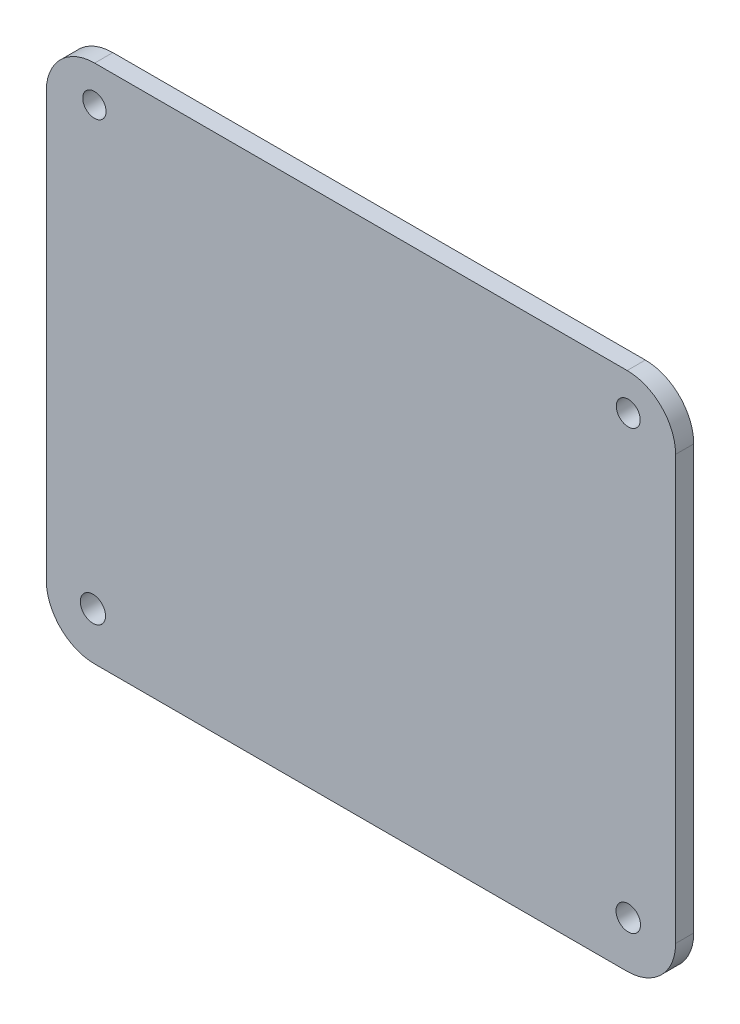
ISO-10303-21;
HEADER;
FILE_DESCRIPTION(('STEP AP214'),'2;1');
FILE_NAME('part.step','',(''),(''),'','','');
FILE_SCHEMA(('AUTOMOTIVE_DESIGN { 1 0 10303 214 1 1 1 1 }'));
ENDSEC;
DATA;
#1=APPLICATION_CONTEXT('core data for automotive mechanical design processes');
#2=APPLICATION_PROTOCOL_DEFINITION('international standard','automotive_design',2000,#1);
#3=PRODUCT_CONTEXT('',#1,'mechanical');
#4=PRODUCT('Part','Part','',(#3));
#5=PRODUCT_RELATED_PRODUCT_CATEGORY('part','',(#4));
#6=PRODUCT_DEFINITION_FORMATION('','',#4);
#7=PRODUCT_DEFINITION_CONTEXT('part definition',#1,'design');
#8=PRODUCT_DEFINITION('design','',#6,#7);
#9=PRODUCT_DEFINITION_SHAPE('','',#8);
#10=(LENGTH_UNIT() NAMED_UNIT(*) SI_UNIT(.MILLI.,.METRE.));
#11=(NAMED_UNIT(*) PLANE_ANGLE_UNIT() SI_UNIT($,.RADIAN.));
#12=(NAMED_UNIT(*) SI_UNIT($,.STERADIAN.) SOLID_ANGLE_UNIT());
#13=UNCERTAINTY_MEASURE_WITH_UNIT(LENGTH_MEASURE(1.E-05),#10,'distance_accuracy_value','');
#14=(GEOMETRIC_REPRESENTATION_CONTEXT(3) GLOBAL_UNCERTAINTY_ASSIGNED_CONTEXT((#13)) GLOBAL_UNIT_ASSIGNED_CONTEXT((#10,
#11,#12)) REPRESENTATION_CONTEXT('',''));
#15=CARTESIAN_POINT('',(0.,0.,0.));
#16=DIRECTION('',(0.,0.,1.));
#17=DIRECTION('',(1.,0.,0.));
#18=AXIS2_PLACEMENT_3D('',#15,#16,#17);
#19=CARTESIAN_POINT('',(-55.88,44.45,3.81));
#20=DIRECTION('',(0.,0.,-1.));
#21=DIRECTION('',(-1.,0.,0.));
#22=AXIS2_PLACEMENT_3D('',#19,#20,#21);
#23=CYLINDRICAL_SURFACE('',#22,10.16);
#24=CARTESIAN_POINT('',(-55.88,44.45,0.));
#25=DIRECTION('',(0.,0.,1.));
#26=DIRECTION('',(1.,0.,0.));
#27=AXIS2_PLACEMENT_3D('',#24,#25,#26);
#28=CIRCLE('',#27,10.16);
#29=CARTESIAN_POINT('',(-55.8799999999999,54.61,0.));
#30=VERTEX_POINT('',#29);
#31=CARTESIAN_POINT('',(-66.04,44.4499999999999,0.));
#32=VERTEX_POINT('',#31);
#33=EDGE_CURVE('E139',#30,#32,#28,.T.);
#34=ORIENTED_EDGE('',*,*,#33,.T.);
#35=DIRECTION('',(0.,0.,-1.));
#36=VECTOR('',#35,1.);
#37=CARTESIAN_POINT('',(-66.04,44.4499999999999,3.81));
#38=LINE('',#37,#36);
#39=CARTESIAN_POINT('',(-66.04,44.4499999999999,3.81));
#40=VERTEX_POINT('',#39);
#41=EDGE_CURVE('E11',#40,#32,#38,.T.);
#42=ORIENTED_EDGE('',*,*,#41,.F.);
#43=CARTESIAN_POINT('',(-55.88,44.45,3.81));
#44=DIRECTION('',(0.,0.,1.));
#45=DIRECTION('',(1.,0.,0.));
#46=AXIS2_PLACEMENT_3D('',#43,#44,#45);
#47=CIRCLE('',#46,10.16);
#48=CARTESIAN_POINT('',(-55.8799999999999,54.61,3.81));
#49=VERTEX_POINT('',#48);
#50=EDGE_CURVE('E162',#49,#40,#47,.T.);
#51=ORIENTED_EDGE('',*,*,#50,.F.);
#52=DIRECTION('',(0.,0.,-1.));
#53=VECTOR('',#52,1.);
#54=CARTESIAN_POINT('',(-55.8799999999999,54.61,3.81));
#55=LINE('',#54,#53);
#56=EDGE_CURVE('E135',#49,#30,#55,.T.);
#57=ORIENTED_EDGE('',*,*,#56,.T.);
#58=EDGE_LOOP('',(#34,#42,#51,#57));
#59=FACE_BOUND('',#58,.T.);
#60=ADVANCED_FACE('F38',(#59),#23,.T.);
#61=CARTESIAN_POINT('',(-66.04,-44.4499999999999,3.81));
#62=DIRECTION('',(1.,0.,0.));
#63=DIRECTION('',(0.,1.,0.));
#64=AXIS2_PLACEMENT_3D('',#61,#62,#63);
#65=PLANE('',#64);
#66=DIRECTION('',(0.,-1.,0.));
#67=VECTOR('',#66,1.);
#68=CARTESIAN_POINT('',(-66.04,-44.4499999999999,0.));
#69=LINE('',#68,#67);
#70=CARTESIAN_POINT('',(-66.04,-44.45,0.));
#71=VERTEX_POINT('',#70);
#72=EDGE_CURVE('E143',#32,#71,#69,.T.);
#73=ORIENTED_EDGE('',*,*,#72,.T.);
#74=DIRECTION('',(0.,0.,-1.));
#75=VECTOR('',#74,1.);
#76=CARTESIAN_POINT('',(-66.04,-44.45,3.81));
#77=LINE('',#76,#75);
#78=CARTESIAN_POINT('',(-66.04,-44.45,3.81));
#79=VERTEX_POINT('',#78);
#80=EDGE_CURVE('E47',#79,#71,#77,.T.);
#81=ORIENTED_EDGE('',*,*,#80,.F.);
#82=DIRECTION('',(0.,-1.,0.));
#83=VECTOR('',#82,1.);
#84=CARTESIAN_POINT('',(-66.04,-44.4499999999999,3.81));
#85=LINE('',#84,#83);
#86=EDGE_CURVE('E98',#40,#79,#85,.T.);
#87=ORIENTED_EDGE('',*,*,#86,.F.);
#88=ORIENTED_EDGE('',*,*,#41,.T.);
#89=EDGE_LOOP('',(#73,#81,#87,#88));
#90=FACE_BOUND('',#89,.T.);
#91=ADVANCED_FACE('F264',(#90),#65,.F.);
#92=CARTESIAN_POINT('',(-55.88,-44.45,3.81));
#93=DIRECTION('',(0.,0.,-1.));
#94=DIRECTION('',(-1.,0.,0.));
#95=AXIS2_PLACEMENT_3D('',#92,#93,#94);
#96=CYLINDRICAL_SURFACE('',#95,10.16);
#97=CARTESIAN_POINT('',(-55.88,-44.45,0.));
#98=DIRECTION('',(0.,0.,1.));
#99=DIRECTION('',(-1.,0.,0.));
#100=AXIS2_PLACEMENT_3D('',#97,#98,#99);
#101=CIRCLE('',#100,10.16);
#102=CARTESIAN_POINT('',(-55.8799999999999,-54.61,0.));
#103=VERTEX_POINT('',#102);
#104=EDGE_CURVE('E147',#71,#103,#101,.T.);
#105=ORIENTED_EDGE('',*,*,#104,.T.);
#106=DIRECTION('',(0.,0.,-1.));
#107=VECTOR('',#106,1.);
#108=CARTESIAN_POINT('',(-55.8799999999999,-54.61,3.81));
#109=LINE('',#108,#107);
#110=CARTESIAN_POINT('',(-55.8799999999999,-54.61,3.81));
#111=VERTEX_POINT('',#110);
#112=EDGE_CURVE('E173',#111,#103,#109,.T.);
#113=ORIENTED_EDGE('',*,*,#112,.F.);
#114=CARTESIAN_POINT('',(-55.88,-44.45,3.81));
#115=DIRECTION('',(0.,0.,1.));
#116=DIRECTION('',(-1.,0.,0.));
#117=AXIS2_PLACEMENT_3D('',#114,#115,#116);
#118=CIRCLE('',#117,10.16);
#119=EDGE_CURVE('E183',#79,#111,#118,.T.);
#120=ORIENTED_EDGE('',*,*,#119,.F.);
#121=ORIENTED_EDGE('',*,*,#80,.T.);
#122=EDGE_LOOP('',(#105,#113,#120,#121));
#123=FACE_BOUND('',#122,.T.);
#124=ADVANCED_FACE('F181',(#123),#96,.T.);
#125=CARTESIAN_POINT('',(55.8799999999999,-54.61,3.81));
#126=DIRECTION('',(0.,1.,0.));
#127=DIRECTION('',(-1.,0.,0.));
#128=AXIS2_PLACEMENT_3D('',#125,#126,#127);
#129=PLANE('',#128);
#130=DIRECTION('',(1.,0.,0.));
#131=VECTOR('',#130,1.);
#132=CARTESIAN_POINT('',(55.8799999999999,-54.61,0.));
#133=LINE('',#132,#131);
#134=CARTESIAN_POINT('',(55.8799999999999,-54.61,0.));
#135=VERTEX_POINT('',#134);
#136=EDGE_CURVE('E150',#103,#135,#133,.T.);
#137=ORIENTED_EDGE('',*,*,#136,.T.);
#138=DIRECTION('',(0.,0.,-1.));
#139=VECTOR('',#138,1.);
#140=CARTESIAN_POINT('',(55.8799999999999,-54.61,3.81));
#141=LINE('',#140,#139);
#142=CARTESIAN_POINT('',(55.8799999999999,-54.61,3.81));
#143=VERTEX_POINT('',#142);
#144=EDGE_CURVE('E169',#143,#135,#141,.T.);
#145=ORIENTED_EDGE('',*,*,#144,.F.);
#146=DIRECTION('',(1.,0.,0.));
#147=VECTOR('',#146,1.);
#148=CARTESIAN_POINT('',(55.8799999999999,-54.61,3.81));
#149=LINE('',#148,#147);
#150=EDGE_CURVE('E196',#111,#143,#149,.T.);
#151=ORIENTED_EDGE('',*,*,#150,.F.);
#152=ORIENTED_EDGE('',*,*,#112,.T.);
#153=EDGE_LOOP('',(#137,#145,#151,#152));
#154=FACE_BOUND('',#153,.T.);
#155=ADVANCED_FACE('F191',(#154),#129,.F.);
#156=CARTESIAN_POINT('',(55.88,-44.45,3.81));
#157=DIRECTION('',(0.,0.,-1.));
#158=DIRECTION('',(-1.,0.,0.));
#159=AXIS2_PLACEMENT_3D('',#156,#157,#158);
#160=CYLINDRICAL_SURFACE('',#159,10.16);
#161=CARTESIAN_POINT('',(55.88,-44.45,0.));
#162=DIRECTION('',(0.,0.,1.));
#163=DIRECTION('',(1.,0.,0.));
#164=AXIS2_PLACEMENT_3D('',#161,#162,#163);
#165=CIRCLE('',#164,10.16);
#166=CARTESIAN_POINT('',(66.04,-44.4499999999999,0.));
#167=VERTEX_POINT('',#166);
#168=EDGE_CURVE('E153',#135,#167,#165,.T.);
#169=ORIENTED_EDGE('',*,*,#168,.T.);
#170=DIRECTION('',(0.,0.,-1.));
#171=VECTOR('',#170,1.);
#172=CARTESIAN_POINT('',(66.04,-44.4499999999999,3.81));
#173=LINE('',#172,#171);
#174=CARTESIAN_POINT('',(66.04,-44.4499999999999,3.81));
#175=VERTEX_POINT('',#174);
#176=EDGE_CURVE('E128',#175,#167,#173,.T.);
#177=ORIENTED_EDGE('',*,*,#176,.F.);
#178=CARTESIAN_POINT('',(55.88,-44.45,3.81));
#179=DIRECTION('',(0.,0.,1.));
#180=DIRECTION('',(1.,0.,0.));
#181=AXIS2_PLACEMENT_3D('',#178,#179,#180);
#182=CIRCLE('',#181,10.16);
#183=EDGE_CURVE('E117',#143,#175,#182,.T.);
#184=ORIENTED_EDGE('',*,*,#183,.F.);
#185=ORIENTED_EDGE('',*,*,#144,.T.);
#186=EDGE_LOOP('',(#169,#177,#184,#185));
#187=FACE_BOUND('',#186,.T.);
#188=ADVANCED_FACE('F194',(#187),#160,.T.);
#189=CARTESIAN_POINT('',(66.04,-44.4499999999999,3.81));
#190=DIRECTION('',(-1.,0.,0.));
#191=DIRECTION('',(0.,-1.,0.));
#192=AXIS2_PLACEMENT_3D('',#189,#190,#191);
#193=PLANE('',#192);
#194=DIRECTION('',(0.,1.,0.));
#195=VECTOR('',#194,1.);
#196=CARTESIAN_POINT('',(66.04,-44.4499999999999,0.));
#197=LINE('',#196,#195);
#198=CARTESIAN_POINT('',(66.04,44.4499999999999,0.));
#199=VERTEX_POINT('',#198);
#200=EDGE_CURVE('E126',#167,#199,#197,.T.);
#201=ORIENTED_EDGE('',*,*,#200,.T.);
#202=DIRECTION('',(0.,0.,-1.));
#203=VECTOR('',#202,1.);
#204=CARTESIAN_POINT('',(66.04,44.4499999999999,3.81));
#205=LINE('',#204,#203);
#206=CARTESIAN_POINT('',(66.04,44.4499999999999,3.81));
#207=VERTEX_POINT('',#206);
#208=EDGE_CURVE('E123',#207,#199,#205,.T.);
#209=ORIENTED_EDGE('',*,*,#208,.F.);
#210=DIRECTION('',(0.,1.,0.));
#211=VECTOR('',#210,1.);
#212=CARTESIAN_POINT('',(66.04,-44.4499999999999,3.81));
#213=LINE('',#212,#211);
#214=EDGE_CURVE('E111',#175,#207,#213,.T.);
#215=ORIENTED_EDGE('',*,*,#214,.F.);
#216=ORIENTED_EDGE('',*,*,#176,.T.);
#217=EDGE_LOOP('',(#201,#209,#215,#216));
#218=FACE_BOUND('',#217,.T.);
#219=ADVANCED_FACE('F124',(#218),#193,.F.);
#220=CARTESIAN_POINT('',(55.88,44.45,3.81));
#221=DIRECTION('',(0.,0.,-1.));
#222=DIRECTION('',(-1.,0.,0.));
#223=AXIS2_PLACEMENT_3D('',#220,#221,#222);
#224=CYLINDRICAL_SURFACE('',#223,10.16);
#225=CARTESIAN_POINT('',(55.88,44.45,0.));
#226=DIRECTION('',(0.,0.,1.));
#227=DIRECTION('',(1.,0.,0.));
#228=AXIS2_PLACEMENT_3D('',#225,#226,#227);
#229=CIRCLE('',#228,10.16);
#230=CARTESIAN_POINT('',(55.8799999999999,54.61,0.));
#231=VERTEX_POINT('',#230);
#232=EDGE_CURVE('E84',#199,#231,#229,.T.);
#233=ORIENTED_EDGE('',*,*,#232,.T.);
#234=DIRECTION('',(0.,0.,-1.));
#235=VECTOR('',#234,1.);
#236=CARTESIAN_POINT('',(55.8799999999999,54.61,3.81));
#237=LINE('',#236,#235);
#238=CARTESIAN_POINT('',(55.8799999999999,54.61,3.81));
#239=VERTEX_POINT('',#238);
#240=EDGE_CURVE('E129',#239,#231,#237,.T.);
#241=ORIENTED_EDGE('',*,*,#240,.F.);
#242=CARTESIAN_POINT('',(55.88,44.45,3.81));
#243=DIRECTION('',(0.,0.,1.));
#244=DIRECTION('',(1.,0.,0.));
#245=AXIS2_PLACEMENT_3D('',#242,#243,#244);
#246=CIRCLE('',#245,10.16);
#247=EDGE_CURVE('E115',#207,#239,#246,.T.);
#248=ORIENTED_EDGE('',*,*,#247,.F.);
#249=ORIENTED_EDGE('',*,*,#208,.T.);
#250=EDGE_LOOP('',(#233,#241,#248,#249));
#251=FACE_BOUND('',#250,.T.);
#252=ADVANCED_FACE('F131',(#251),#224,.T.);
#253=CARTESIAN_POINT('',(55.8799999999999,54.61,3.81));
#254=DIRECTION('',(0.,-1.,0.));
#255=DIRECTION('',(1.,0.,0.));
#256=AXIS2_PLACEMENT_3D('',#253,#254,#255);
#257=PLANE('',#256);
#258=DIRECTION('',(-1.,0.,0.));
#259=VECTOR('',#258,1.);
#260=CARTESIAN_POINT('',(55.8799999999999,54.61,0.));
#261=LINE('',#260,#259);
#262=EDGE_CURVE('E90',#231,#30,#261,.T.);
#263=ORIENTED_EDGE('',*,*,#262,.T.);
#264=ORIENTED_EDGE('',*,*,#56,.F.);
#265=DIRECTION('',(-1.,0.,0.));
#266=VECTOR('',#265,1.);
#267=CARTESIAN_POINT('',(55.8799999999999,54.61,3.81));
#268=LINE('',#267,#266);
#269=EDGE_CURVE('E55',#239,#49,#268,.T.);
#270=ORIENTED_EDGE('',*,*,#269,.F.);
#271=ORIENTED_EDGE('',*,*,#240,.T.);
#272=EDGE_LOOP('',(#263,#264,#270,#271));
#273=FACE_BOUND('',#272,.T.);
#274=ADVANCED_FACE('F243',(#273),#257,.F.);
#275=CARTESIAN_POINT('',(-55.88,44.45,3.81));
#276=DIRECTION('',(0.,0.,1.));
#277=DIRECTION('',(1.,0.,0.));
#278=AXIS2_PLACEMENT_3D('',#275,#276,#277);
#279=PLANE('',#278);
#280=CARTESIAN_POINT('',(-56.2442411731515,-44.7581536726415,3.81));
#281=DIRECTION('',(0.,0.,1.));
#282=DIRECTION('',(1.,0.,0.));
#283=AXIS2_PLACEMENT_3D('',#280,#281,#282);
#284=CIRCLE('',#283,2.64913191610154);
#285=CARTESIAN_POINT('',(-53.59510925705,-44.7581536726415,3.81));
#286=VERTEX_POINT('',#285);
#287=EDGE_CURVE('E219',#286,#286,#284,.T.);
#288=ORIENTED_EDGE('',*,*,#287,.F.);
#289=EDGE_LOOP('',(#288));
#290=FACE_BOUND('',#289,.T.);
#291=CARTESIAN_POINT('',(56.1059831573865,-44.7581536726414,3.81));
#292=DIRECTION('',(0.,0.,1.));
#293=DIRECTION('',(1.,0.,0.));
#294=AXIS2_PLACEMENT_3D('',#291,#292,#293);
#295=CIRCLE('',#294,2.57072396502848);
#296=CARTESIAN_POINT('',(58.6767071224149,-44.7581536726414,3.81));
#297=VERTEX_POINT('',#296);
#298=EDGE_CURVE('E218',#297,#297,#295,.T.);
#299=ORIENTED_EDGE('',*,*,#298,.F.);
#300=EDGE_LOOP('',(#299));
#301=FACE_BOUND('',#300,.T.);
#302=CARTESIAN_POINT('',(56.1059831573864,46.9900000000001,3.81));
#303=DIRECTION('',(0.,0.,1.));
#304=DIRECTION('',(1.,0.,0.));
#305=AXIS2_PLACEMENT_3D('',#302,#303,#304);
#306=CIRCLE('',#305,2.5147514933329);
#307=CARTESIAN_POINT('',(58.6207346507194,46.9900000000001,3.81));
#308=VERTEX_POINT('',#307);
#309=EDGE_CURVE('E227',#308,#308,#306,.T.);
#310=ORIENTED_EDGE('',*,*,#309,.F.);
#311=EDGE_LOOP('',(#310));
#312=FACE_BOUND('',#311,.T.);
#313=CARTESIAN_POINT('',(-55.93608750051,46.9900000000001,3.81));
#314=DIRECTION('',(0.,0.,1.));
#315=DIRECTION('',(1.,0.,0.));
#316=AXIS2_PLACEMENT_3D('',#313,#314,#315);
#317=CIRCLE('',#316,2.44752169407484);
#318=CARTESIAN_POINT('',(-53.4885658064351,46.9900000000001,3.81));
#319=VERTEX_POINT('',#318);
#320=EDGE_CURVE('E209',#319,#319,#317,.T.);
#321=ORIENTED_EDGE('',*,*,#320,.F.);
#322=EDGE_LOOP('',(#321));
#323=FACE_BOUND('',#322,.T.);
#324=ORIENTED_EDGE('',*,*,#50,.T.);
#325=ORIENTED_EDGE('',*,*,#86,.T.);
#326=ORIENTED_EDGE('',*,*,#119,.T.);
#327=ORIENTED_EDGE('',*,*,#150,.T.);
#328=ORIENTED_EDGE('',*,*,#183,.T.);
#329=ORIENTED_EDGE('',*,*,#214,.T.);
#330=ORIENTED_EDGE('',*,*,#247,.T.);
#331=ORIENTED_EDGE('',*,*,#269,.T.);
#332=EDGE_LOOP('',(#324,#325,#326,#327,#328,#329,#330,#331));
#333=FACE_BOUND('',#332,.T.);
#334=ADVANCED_FACE('F113',(#290,#301,#312,#323,#333),#279,.T.);
#335=CARTESIAN_POINT('',(-55.88,44.45,0.));
#336=DIRECTION('',(0.,0.,1.));
#337=DIRECTION('',(1.,0.,0.));
#338=AXIS2_PLACEMENT_3D('',#335,#336,#337);
#339=PLANE('',#338);
#340=CARTESIAN_POINT('',(-56.2442411731515,-44.7581536726415,0.));
#341=DIRECTION('',(0.,0.,1.));
#342=DIRECTION('',(1.,0.,0.));
#343=AXIS2_PLACEMENT_3D('',#340,#341,#342);
#344=CIRCLE('',#343,2.64913191610154);
#345=CARTESIAN_POINT('',(-53.59510925705,-44.7581536726415,0.));
#346=VERTEX_POINT('',#345);
#347=EDGE_CURVE('E214',#346,#346,#344,.F.);
#348=ORIENTED_EDGE('',*,*,#347,.F.);
#349=EDGE_LOOP('',(#348));
#350=FACE_BOUND('',#349,.T.);
#351=CARTESIAN_POINT('',(56.1059831573865,-44.7581536726414,0.));
#352=DIRECTION('',(0.,0.,1.));
#353=DIRECTION('',(1.,0.,0.));
#354=AXIS2_PLACEMENT_3D('',#351,#352,#353);
#355=CIRCLE('',#354,2.57072396502848);
#356=CARTESIAN_POINT('',(58.6767071224149,-44.7581536726414,0.));
#357=VERTEX_POINT('',#356);
#358=EDGE_CURVE('E223',#357,#357,#355,.F.);
#359=ORIENTED_EDGE('',*,*,#358,.F.);
#360=EDGE_LOOP('',(#359));
#361=FACE_BOUND('',#360,.T.);
#362=CARTESIAN_POINT('',(56.1059831573864,46.9900000000001,0.));
#363=DIRECTION('',(0.,0.,1.));
#364=DIRECTION('',(1.,0.,0.));
#365=AXIS2_PLACEMENT_3D('',#362,#363,#364);
#366=CIRCLE('',#365,2.5147514933329);
#367=CARTESIAN_POINT('',(58.6207346507194,46.9900000000001,0.));
#368=VERTEX_POINT('',#367);
#369=EDGE_CURVE('E213',#368,#368,#366,.F.);
#370=ORIENTED_EDGE('',*,*,#369,.F.);
#371=EDGE_LOOP('',(#370));
#372=FACE_BOUND('',#371,.T.);
#373=CARTESIAN_POINT('',(-55.93608750051,46.9900000000001,0.));
#374=DIRECTION('',(0.,0.,1.));
#375=DIRECTION('',(1.,0.,0.));
#376=AXIS2_PLACEMENT_3D('',#373,#374,#375);
#377=CIRCLE('',#376,2.44752169407484);
#378=CARTESIAN_POINT('',(-53.4885658064351,46.9900000000001,0.));
#379=VERTEX_POINT('',#378);
#380=EDGE_CURVE('E144',#379,#379,#377,.F.);
#381=ORIENTED_EDGE('',*,*,#380,.F.);
#382=EDGE_LOOP('',(#381));
#383=FACE_BOUND('',#382,.T.);
#384=ORIENTED_EDGE('',*,*,#33,.F.);
#385=ORIENTED_EDGE('',*,*,#262,.F.);
#386=ORIENTED_EDGE('',*,*,#232,.F.);
#387=ORIENTED_EDGE('',*,*,#200,.F.);
#388=ORIENTED_EDGE('',*,*,#168,.F.);
#389=ORIENTED_EDGE('',*,*,#136,.F.);
#390=ORIENTED_EDGE('',*,*,#104,.F.);
#391=ORIENTED_EDGE('',*,*,#72,.F.);
#392=EDGE_LOOP('',(#384,#385,#386,#387,#388,#389,#390,#391));
#393=FACE_BOUND('',#392,.T.);
#394=ADVANCED_FACE('F187',(#350,#361,#372,#383,#393),#339,.F.);
#395=CARTESIAN_POINT('',(-55.93608750051,46.9900000000001,-0.00100000000000013));
#396=DIRECTION('',(0.,0.,1.));
#397=DIRECTION('',(1.,0.,0.));
#398=AXIS2_PLACEMENT_3D('',#395,#396,#397);
#399=CYLINDRICAL_SURFACE('',#398,2.44752169407484);
#400=ORIENTED_EDGE('',*,*,#320,.T.);
#401=EDGE_LOOP('',(#400));
#402=FACE_BOUND('',#401,.T.);
#403=ORIENTED_EDGE('',*,*,#380,.T.);
#404=EDGE_LOOP('',(#403));
#405=FACE_BOUND('',#404,.T.);
#406=ADVANCED_FACE('F248',(#402,#405),#399,.F.);
#407=CARTESIAN_POINT('',(56.1059831573864,46.9900000000001,-0.00100000000000013));
#408=DIRECTION('',(0.,0.,1.));
#409=DIRECTION('',(1.,0.,0.));
#410=AXIS2_PLACEMENT_3D('',#407,#408,#409);
#411=CYLINDRICAL_SURFACE('',#410,2.5147514933329);
#412=ORIENTED_EDGE('',*,*,#309,.T.);
#413=EDGE_LOOP('',(#412));
#414=FACE_BOUND('',#413,.T.);
#415=ORIENTED_EDGE('',*,*,#369,.T.);
#416=EDGE_LOOP('',(#415));
#417=FACE_BOUND('',#416,.T.);
#418=ADVANCED_FACE('F238',(#414,#417),#411,.F.);
#419=CARTESIAN_POINT('',(56.1059831573865,-44.7581536726414,-0.00100000000000013));
#420=DIRECTION('',(0.,0.,1.));
#421=DIRECTION('',(1.,0.,0.));
#422=AXIS2_PLACEMENT_3D('',#419,#420,#421);
#423=CYLINDRICAL_SURFACE('',#422,2.57072396502848);
#424=ORIENTED_EDGE('',*,*,#298,.T.);
#425=EDGE_LOOP('',(#424));
#426=FACE_BOUND('',#425,.T.);
#427=ORIENTED_EDGE('',*,*,#358,.T.);
#428=EDGE_LOOP('',(#427));
#429=FACE_BOUND('',#428,.T.);
#430=ADVANCED_FACE('F329',(#426,#429),#423,.F.);
#431=CARTESIAN_POINT('',(-56.2442411731515,-44.7581536726415,-0.00100000000000013));
#432=DIRECTION('',(0.,0.,1.));
#433=DIRECTION('',(1.,0.,0.));
#434=AXIS2_PLACEMENT_3D('',#431,#432,#433);
#435=CYLINDRICAL_SURFACE('',#434,2.64913191610154);
#436=ORIENTED_EDGE('',*,*,#287,.T.);
#437=EDGE_LOOP('',(#436));
#438=FACE_BOUND('',#437,.T.);
#439=ORIENTED_EDGE('',*,*,#347,.T.);
#440=EDGE_LOOP('',(#439));
#441=FACE_BOUND('',#440,.T.);
#442=ADVANCED_FACE('F336',(#438,#441),#435,.F.);
#443=CLOSED_SHELL('',(#60,#91,#124,#155,#188,#219,#252,#274,#334,#394,#406,#418,#430,#442));
#444=MANIFOLD_SOLID_BREP('B2',#443);
#445=ADVANCED_BREP_SHAPE_REPRESENTATION('',(#18,#444),#14);
#446=SHAPE_DEFINITION_REPRESENTATION(#9,#445);
ENDSEC;
END-ISO-10303-21;
